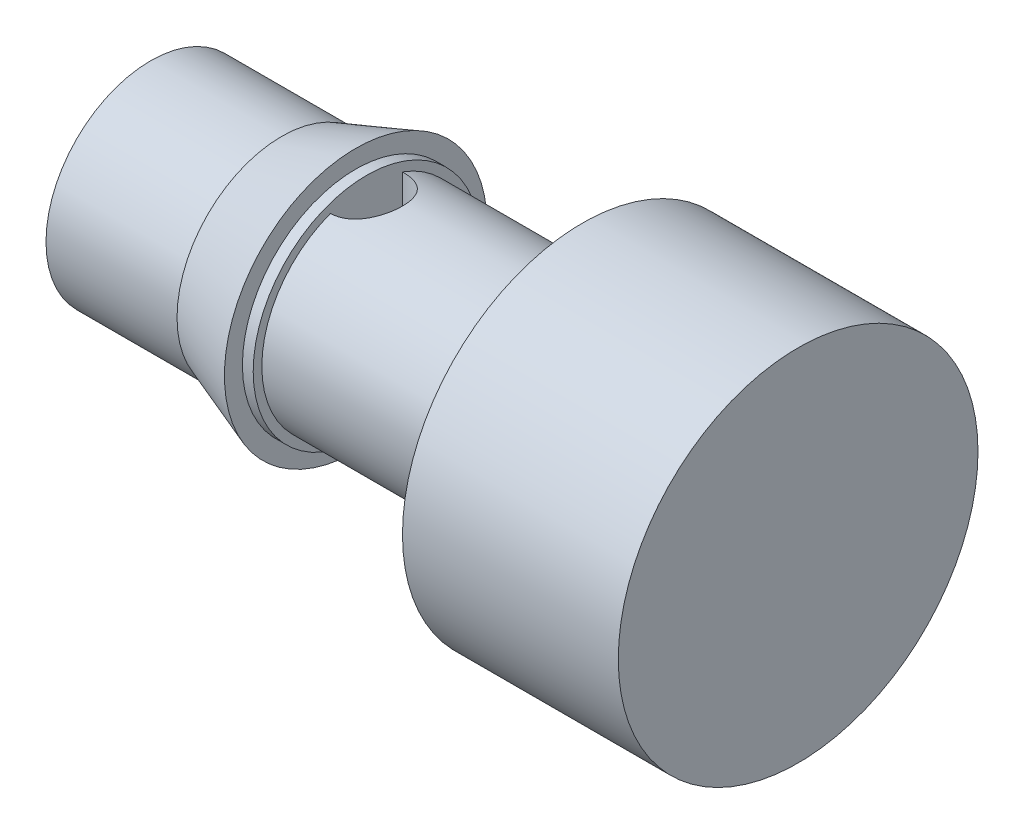
ISO-10303-21;
HEADER;
FILE_DESCRIPTION(('STEP AP214'),'2;1');
FILE_NAME('part.step','',(''),(''),'','','');
FILE_SCHEMA(('AUTOMOTIVE_DESIGN { 1 0 10303 214 1 1 1 1 }'));
ENDSEC;
DATA;
#1=APPLICATION_CONTEXT('core data for automotive mechanical design processes');
#2=APPLICATION_PROTOCOL_DEFINITION('international standard','automotive_design',2000,#1);
#3=PRODUCT_CONTEXT('',#1,'mechanical');
#4=PRODUCT('Part','Part','',(#3));
#5=PRODUCT_RELATED_PRODUCT_CATEGORY('part','',(#4));
#6=PRODUCT_DEFINITION_FORMATION('','',#4);
#7=PRODUCT_DEFINITION_CONTEXT('part definition',#1,'design');
#8=PRODUCT_DEFINITION('design','',#6,#7);
#9=PRODUCT_DEFINITION_SHAPE('','',#8);
#10=(LENGTH_UNIT() NAMED_UNIT(*) SI_UNIT(.MILLI.,.METRE.));
#11=(NAMED_UNIT(*) PLANE_ANGLE_UNIT() SI_UNIT($,.RADIAN.));
#12=(NAMED_UNIT(*) SI_UNIT($,.STERADIAN.) SOLID_ANGLE_UNIT());
#13=UNCERTAINTY_MEASURE_WITH_UNIT(LENGTH_MEASURE(1.E-05),#10,'distance_accuracy_value','');
#14=(GEOMETRIC_REPRESENTATION_CONTEXT(3) GLOBAL_UNCERTAINTY_ASSIGNED_CONTEXT((#13)) GLOBAL_UNIT_ASSIGNED_CONTEXT((#10,
#11,#12)) REPRESENTATION_CONTEXT('',''));
#15=CARTESIAN_POINT('',(0.,0.,0.));
#16=DIRECTION('',(0.,0.,1.));
#17=DIRECTION('',(1.,0.,0.));
#18=AXIS2_PLACEMENT_3D('',#15,#16,#17);
#19=CARTESIAN_POINT('',(6.,0.,0.));
#20=DIRECTION('',(-1.,0.,0.));
#21=DIRECTION('',(0.,0.,1.));
#22=AXIS2_PLACEMENT_3D('',#19,#20,#21);
#23=CYLINDRICAL_SURFACE('',#22,1.455);
#24=CARTESIAN_POINT('',(6.,0.,0.));
#25=DIRECTION('',(1.,0.,0.));
#26=DIRECTION('',(0.,0.,-1.));
#27=AXIS2_PLACEMENT_3D('',#24,#25,#26);
#28=CIRCLE('',#27,1.455);
#29=CARTESIAN_POINT('',(6.,0.,-1.455));
#30=VERTEX_POINT('',#29);
#31=EDGE_CURVE('E164',#30,#30,#28,.T.);
#32=ORIENTED_EDGE('',*,*,#31,.F.);
#33=EDGE_LOOP('',(#32));
#34=FACE_BOUND('',#33,.T.);
#35=CARTESIAN_POINT('',(3.,0.,0.));
#36=DIRECTION('',(-1.,0.,0.));
#37=DIRECTION('',(0.,0.,1.));
#38=AXIS2_PLACEMENT_3D('',#35,#36,#37);
#39=CIRCLE('',#38,1.455);
#40=CARTESIAN_POINT('',(3.,1.36639123240747,-0.500000000000001));
#41=VERTEX_POINT('',#40);
#42=CARTESIAN_POINT('',(3.,-1.36639123240747,-0.500000000000001));
#43=VERTEX_POINT('',#42);
#44=EDGE_CURVE('E191',#41,#43,#39,.T.);
#45=ORIENTED_EDGE('',*,*,#44,.F.);
#46=CARTESIAN_POINT('',(3.,1.36639123240747,0.500000000000001));
#47=CARTESIAN_POINT('',(2.97282044008254,1.36639097811817,0.500000312731613));
#48=CARTESIAN_POINT('',(2.94564304194958,1.3672110489003,0.497776345713997));
#49=CARTESIAN_POINT('',(2.89209683987012,1.37038431023373,0.488971673841802));
#50=CARTESIAN_POINT('',(2.86572812829729,1.37273767525038,0.482390473199555));
#51=CARTESIAN_POINT('',(2.81458437582896,1.37868015875037,0.465132564264616));
#52=CARTESIAN_POINT('',(2.78980617322112,1.38226672943625,0.454464294689386));
#53=CARTESIAN_POINT('',(2.74238273764721,1.39026770944465,0.42936418702639));
#54=CARTESIAN_POINT('',(2.71973802190004,1.39468231873585,0.414931439499747));
#55=CARTESIAN_POINT('',(2.67628200580682,1.40404795409862,0.382068692414853));
#56=CARTESIAN_POINT('',(2.65557235017231,1.40901294814996,0.363508230347457));
#57=CARTESIAN_POINT('',(2.61748973640978,1.41880223847988,0.323194958876108));
#58=CARTESIAN_POINT('',(2.60011735287873,1.42362651040849,0.301441600868594));
#59=CARTESIAN_POINT('',(2.56873456155451,1.43275353066899,0.25461005240966));
#60=CARTESIAN_POINT('',(2.55483159909054,1.43703795070782,0.229455972061945));
#61=CARTESIAN_POINT('',(2.53149510799792,1.44443717268994,0.176993427231699));
#62=CARTESIAN_POINT('',(2.52206029405022,1.44755231093828,0.149685584945858));
#63=CARTESIAN_POINT('',(2.50827538591302,1.45216299283854,0.0947571154949555));
#64=CARTESIAN_POINT('',(2.50375096166485,1.45371391556177,0.0671849745644268));
#65=CARTESIAN_POINT('',(2.4993599452638,1.45521851130384,0.0116321325668065));
#66=CARTESIAN_POINT('',(2.49949207878631,1.45517262131027,-0.016348454628745));
#67=CARTESIAN_POINT('',(2.50430199111636,1.45352574816606,-0.0706863211139652));
#68=CARTESIAN_POINT('',(2.50879020966484,1.45198961593433,-0.09706267186014));
#69=CARTESIAN_POINT('',(2.52187013887379,1.44761714360993,-0.148662052440881));
#70=CARTESIAN_POINT('',(2.53046213173979,1.44478071409985,-0.173885002828482));
#71=CARTESIAN_POINT('',(2.55161083528952,1.43804602880742,-0.222864410317829));
#72=CARTESIAN_POINT('',(2.56421967890936,1.43413390908427,-0.246596372051855));
#73=CARTESIAN_POINT('',(2.59300052287427,1.42565240959854,-0.291662127171063));
#74=CARTESIAN_POINT('',(2.60917355635141,1.42108283939799,-0.312995222496682));
#75=CARTESIAN_POINT('',(2.64556924048506,1.41149683623094,-0.353783192591456));
#76=CARTESIAN_POINT('',(2.6659535496993,1.40646948255308,-0.373091465112166));
#77=CARTESIAN_POINT('',(2.70971096898476,1.39672419493074,-0.408064861632907));
#78=CARTESIAN_POINT('',(2.73308460079606,1.39200631521816,-0.423729348317868));
#79=CARTESIAN_POINT('',(2.78264832167894,1.38335212869181,-0.451190983426911));
#80=CARTESIAN_POINT('',(2.80887746663472,1.37942952410187,-0.462922294548846));
#81=CARTESIAN_POINT('',(2.86310811807453,1.37296824111035,-0.481750423449409));
#82=CARTESIAN_POINT('',(2.89110881913969,1.37042893878043,-0.488849330926126));
#83=CARTESIAN_POINT('',(2.9466602527285,1.36716435499601,-0.497904436508698));
#84=CARTESIAN_POINT('',(2.97416896753564,1.36635848431615,-0.500089329754137));
#85=CARTESIAN_POINT('',(3.02916592318218,1.36642601678656,-0.499905109547407));
#86=CARTESIAN_POINT('',(3.05665416698352,1.3672990898199,-0.497536891336228));
#87=CARTESIAN_POINT('',(3.10975938349391,1.37054542078883,-0.488519667509383));
#88=CARTESIAN_POINT('',(3.13540790954479,1.37286149883476,-0.48203365376347));
#89=CARTESIAN_POINT('',(3.18524603270589,1.37866879378836,-0.465162761685819));
#90=CARTESIAN_POINT('',(3.20943536017642,1.38216022710582,-0.454777165311102));
#91=CARTESIAN_POINT('',(3.25655901904507,1.39006814276105,-0.43001094582003));
#92=CARTESIAN_POINT('',(3.2794250355621,1.39451148507407,-0.415509150754988));
#93=CARTESIAN_POINT('',(3.32248142977751,1.40377216610918,-0.383057444619011));
#94=CARTESIAN_POINT('',(3.34267096826601,1.40858962138712,-0.365106456354439));
#95=CARTESIAN_POINT('',(3.38087999417741,1.4183566247392,-0.325165888852871));
#96=CARTESIAN_POINT('',(3.3987335534274,1.42330014506522,-0.303015612372771));
#97=CARTESIAN_POINT('',(3.43048320392665,1.43251855204168,-0.255911546870538));
#98=CARTESIAN_POINT('',(3.44437940750592,1.43679345766928,-0.230957837452241));
#99=CARTESIAN_POINT('',(3.46769853808854,1.44417620196691,-0.179059058741342));
#100=CARTESIAN_POINT('',(3.47714814746578,1.44729097799921,-0.152127018589827));
#101=CARTESIAN_POINT('',(3.49134145346222,1.45203172010686,-0.0969269784819325));
#102=CARTESIAN_POINT('',(3.49608696803861,1.45365826131074,-0.0686594990512471));
#103=CARTESIAN_POINT('',(3.50056578047329,1.45519317203768,-0.0131041048340675));
#104=CARTESIAN_POINT('',(3.50053661789388,1.45518296986363,0.0141626088901563));
#105=CARTESIAN_POINT('',(3.49605881674393,1.45364883351676,0.068284584430689));
#106=CARTESIAN_POINT('',(3.49161057541087,1.4521250354033,0.0951398830093806));
#107=CARTESIAN_POINT('',(3.4785811711584,1.44776668608656,0.147199119922217));
#108=CARTESIAN_POINT('',(3.47007483164858,1.44495590074719,0.172423918976896));
#109=CARTESIAN_POINT('',(3.44924106511386,1.43831337530625,0.221096451645462));
#110=CARTESIAN_POINT('',(3.43691293401043,1.43448144710052,0.244543856823398));
#111=CARTESIAN_POINT('',(3.40824273974474,1.42600590188723,0.28997734186848));
#112=CARTESIAN_POINT('',(3.39176488452778,1.42133679417001,0.311872906947895));
#113=CARTESIAN_POINT('',(3.35548977465473,1.41176919148188,0.352664883251738));
#114=CARTESIAN_POINT('',(3.33569142778947,1.40687062141728,0.371560303644531));
#115=CARTESIAN_POINT('',(3.29233656772363,1.39714764987157,0.40663128516264));
#116=CARTESIAN_POINT('',(3.26865644725596,1.39233516519014,0.422657858662001));
#117=CARTESIAN_POINT('',(3.21878764286122,1.38357941215645,0.450496342588288));
#118=CARTESIAN_POINT('',(3.19259941591023,1.37963598589265,0.462309018939636));
#119=CARTESIAN_POINT('',(3.13908764556529,1.37320179115005,0.48108071708729));
#120=CARTESIAN_POINT('',(3.11180721552094,1.37067801956557,0.488150816278888));
#121=CARTESIAN_POINT('',(3.05635017006794,1.36727320579147,0.497609344327993));
#122=CARTESIAN_POINT('',(3.02817392360614,1.36639149599994,0.499999675827108));
#123=CARTESIAN_POINT('',(3.,1.36639123240747,0.500000000000001));
#124=B_SPLINE_CURVE_WITH_KNOTS('',3,(#46,#47,#48,#49,#50,#51,#52,#53,#54,#55,#56,#57,#58,#59,
#60,#61,#62,#63,#64,#65,#66,#67,#68,#69,#70,#71,#72,#73,#74,#75,#76,#77,#78,#79,#80,#81,#82,#83,
#84,#85,#86,#87,#88,#89,#90,#91,#92,#93,#94,#95,#96,#97,#98,#99,#100,#101,#102,#103,#104,#105,
#106,#107,#108,#109,#110,#111,#112,#113,#114,#115,#116,#117,#118,#119,#120,#121,#122,#123),
.UNSPECIFIED.,.T.,.F.,(4,2,2,2,2,2,2,2,2,2,2,2,2,2,2,2,2,2,2,2,2,2,2,2,2,2,2,2,2,2,2,2,2,2,2,2,
2,2,4),(0.,0.0814342083502881,0.162877684281834,0.244153899431236,0.325449767856164,
0.409818297556403,0.494201340468621,0.580941073467996,0.667655839514619,0.751179712047528,
0.83468072741757,0.914703835375722,0.994732447100178,1.07584520035367,1.1569814963114,
1.24216162082256,1.32735663254974,1.41391378507749,1.50043186424294,1.58283194249355,
1.66521582074902,1.74452634377262,1.82385147767105,1.90580983357864,1.98779382705759,
2.07401200384483,2.16022773307441,2.24591929981545,2.33157773703578,2.41297604003756,
2.49436702668819,2.57431213634006,2.65427198282888,2.73729800330363,2.82035138727782,
2.90692039451618,2.99347365881173,3.07792147702076,3.16233495435282),.UNSPECIFIED.);
#125=CARTESIAN_POINT('',(3.,1.36639123240747,0.500000000000001));
#126=VERTEX_POINT('',#125);
#127=EDGE_CURVE('E174',#41,#126,#124,.T.);
#128=ORIENTED_EDGE('',*,*,#127,.T.);
#129=CARTESIAN_POINT('',(3.,-1.36639123240747,0.500000000000001));
#130=VERTEX_POINT('',#129);
#131=EDGE_CURVE('E181',#130,#126,#39,.T.);
#132=ORIENTED_EDGE('',*,*,#131,.F.);
#133=CARTESIAN_POINT('',(3.,-1.36639123240747,0.500000000000001));
#134=CARTESIAN_POINT('',(3.02717955991746,-1.36639097811817,0.500000312731613));
#135=CARTESIAN_POINT('',(3.05435695805042,-1.3672110489003,0.497776345713997));
#136=CARTESIAN_POINT('',(3.10790316012988,-1.37038431023373,0.488971673841802));
#137=CARTESIAN_POINT('',(3.13427187170271,-1.37273767525038,0.482390473199555));
#138=CARTESIAN_POINT('',(3.18541562417104,-1.37868015875037,0.465132564264616));
#139=CARTESIAN_POINT('',(3.21019382677888,-1.38226672943625,0.454464294689386));
#140=CARTESIAN_POINT('',(3.25761726235279,-1.39026770944465,0.42936418702639));
#141=CARTESIAN_POINT('',(3.28026197809996,-1.39468231873585,0.414931439499747));
#142=CARTESIAN_POINT('',(3.32371799419318,-1.40404795409862,0.382068692414853));
#143=CARTESIAN_POINT('',(3.34442764982769,-1.40901294814996,0.363508230347457));
#144=CARTESIAN_POINT('',(3.38251026359022,-1.41880223847988,0.323194958876108));
#145=CARTESIAN_POINT('',(3.39988264712127,-1.42362651040849,0.301441600868594));
#146=CARTESIAN_POINT('',(3.43126543844549,-1.43275353066899,0.25461005240966));
#147=CARTESIAN_POINT('',(3.44516840090946,-1.43703795070782,0.229455972061945));
#148=CARTESIAN_POINT('',(3.46850489200208,-1.44443717268994,0.176993427231699));
#149=CARTESIAN_POINT('',(3.47793970594978,-1.44755231093828,0.149685584945858));
#150=CARTESIAN_POINT('',(3.49172461408698,-1.45216299283854,0.0947571154949555));
#151=CARTESIAN_POINT('',(3.49624903833515,-1.45371391556177,0.0671849745644268));
#152=CARTESIAN_POINT('',(3.5006400547362,-1.45521851130384,0.0116321325668065));
#153=CARTESIAN_POINT('',(3.50050792121369,-1.45517262131027,-0.016348454628745));
#154=CARTESIAN_POINT('',(3.49569800888364,-1.45352574816606,-0.0706863211139652));
#155=CARTESIAN_POINT('',(3.49120979033516,-1.45198961593433,-0.0970626718601401));
#156=CARTESIAN_POINT('',(3.47812986112621,-1.44761714360993,-0.148662052440881));
#157=CARTESIAN_POINT('',(3.46953786826021,-1.44478071409985,-0.173885002828482));
#158=CARTESIAN_POINT('',(3.44838916471048,-1.43804602880742,-0.222864410317829));
#159=CARTESIAN_POINT('',(3.43578032109064,-1.43413390908427,-0.246596372051854));
#160=CARTESIAN_POINT('',(3.40699947712573,-1.42565240959854,-0.291662127171063));
#161=CARTESIAN_POINT('',(3.39082644364859,-1.42108283939799,-0.312995222496682));
#162=CARTESIAN_POINT('',(3.35443075951494,-1.41149683623094,-0.353783192591456));
#163=CARTESIAN_POINT('',(3.3340464503007,-1.40646948255308,-0.373091465112166));
#164=CARTESIAN_POINT('',(3.29028903101524,-1.39672419493074,-0.408064861632907));
#165=CARTESIAN_POINT('',(3.26691539920394,-1.39200631521816,-0.423729348317868));
#166=CARTESIAN_POINT('',(3.21735167832106,-1.38335212869181,-0.451190983426911));
#167=CARTESIAN_POINT('',(3.19112253336528,-1.37942952410187,-0.462922294548846));
#168=CARTESIAN_POINT('',(3.13689188192548,-1.37296824111035,-0.481750423449409));
#169=CARTESIAN_POINT('',(3.10889118086031,-1.37042893878043,-0.488849330926126));
#170=CARTESIAN_POINT('',(3.0533397472715,-1.36716435499601,-0.497904436508698));
#171=CARTESIAN_POINT('',(3.02583103246436,-1.36635848431615,-0.500089329754137));
#172=CARTESIAN_POINT('',(2.97083407681782,-1.36642601678656,-0.499905109547407));
#173=CARTESIAN_POINT('',(2.94334583301648,-1.3672990898199,-0.497536891336228));
#174=CARTESIAN_POINT('',(2.89024061650609,-1.37054542078883,-0.488519667509383));
#175=CARTESIAN_POINT('',(2.86459209045521,-1.37286149883476,-0.48203365376347));
#176=CARTESIAN_POINT('',(2.81475396729411,-1.37866879378836,-0.465162761685819));
#177=CARTESIAN_POINT('',(2.79056463982358,-1.38216022710582,-0.454777165311102));
#178=CARTESIAN_POINT('',(2.74344098095493,-1.39006814276105,-0.43001094582003));
#179=CARTESIAN_POINT('',(2.7205749644379,-1.39451148507407,-0.415509150754988));
#180=CARTESIAN_POINT('',(2.6775185702225,-1.40377216610918,-0.383057444619011));
#181=CARTESIAN_POINT('',(2.65732903173399,-1.40858962138712,-0.365106456354439));
#182=CARTESIAN_POINT('',(2.61912000582259,-1.4183566247392,-0.325165888852871));
#183=CARTESIAN_POINT('',(2.6012664465726,-1.42330014506522,-0.303015612372771));
#184=CARTESIAN_POINT('',(2.56951679607335,-1.43251855204168,-0.255911546870538));
#185=CARTESIAN_POINT('',(2.55562059249408,-1.43679345766928,-0.230957837452241));
#186=CARTESIAN_POINT('',(2.53230146191146,-1.44417620196691,-0.179059058741342));
#187=CARTESIAN_POINT('',(2.52285185253422,-1.44729097799921,-0.152127018589827));
#188=CARTESIAN_POINT('',(2.50865854653778,-1.45203172010686,-0.0969269784819325));
#189=CARTESIAN_POINT('',(2.50391303196139,-1.45365826131074,-0.068659499051247));
#190=CARTESIAN_POINT('',(2.49943421952671,-1.45519317203768,-0.0131041048340675));
#191=CARTESIAN_POINT('',(2.49946338210612,-1.45518296986363,0.0141626088901562));
#192=CARTESIAN_POINT('',(2.50394118325607,-1.45364883351676,0.068284584430689));
#193=CARTESIAN_POINT('',(2.50838942458913,-1.4521250354033,0.0951398830093806));
#194=CARTESIAN_POINT('',(2.5214188288416,-1.44776668608656,0.147199119922217));
#195=CARTESIAN_POINT('',(2.52992516835142,-1.44495590074719,0.172423918976896));
#196=CARTESIAN_POINT('',(2.55075893488614,-1.43831337530625,0.221096451645462));
#197=CARTESIAN_POINT('',(2.56308706598957,-1.43448144710052,0.244543856823398));
#198=CARTESIAN_POINT('',(2.59175726025526,-1.42600590188723,0.28997734186848));
#199=CARTESIAN_POINT('',(2.60823511547222,-1.42133679417001,0.311872906947894));
#200=CARTESIAN_POINT('',(2.64451022534527,-1.41176919148188,0.352664883251738));
#201=CARTESIAN_POINT('',(2.66430857221053,-1.40687062141728,0.371560303644531));
#202=CARTESIAN_POINT('',(2.70766343227637,-1.39714764987157,0.40663128516264));
#203=CARTESIAN_POINT('',(2.73134355274404,-1.39233516519014,0.422657858662002));
#204=CARTESIAN_POINT('',(2.78121235713878,-1.38357941215645,0.450496342588288));
#205=CARTESIAN_POINT('',(2.80740058408977,-1.37963598589265,0.462309018939636));
#206=CARTESIAN_POINT('',(2.86091235443471,-1.37320179115005,0.48108071708729));
#207=CARTESIAN_POINT('',(2.88819278447906,-1.37067801956557,0.488150816278888));
#208=CARTESIAN_POINT('',(2.94364982993206,-1.36727320579147,0.497609344327993));
#209=CARTESIAN_POINT('',(2.97182607639386,-1.36639149599994,0.499999675827108));
#210=CARTESIAN_POINT('',(3.,-1.36639123240747,0.500000000000001));
#211=B_SPLINE_CURVE_WITH_KNOTS('',3,(#133,#134,#135,#136,#137,#138,#139,#140,#141,#142,#143,
#144,#145,#146,#147,#148,#149,#150,#151,#152,#153,#154,#155,#156,#157,#158,#159,#160,#161,#162,
#163,#164,#165,#166,#167,#168,#169,#170,#171,#172,#173,#174,#175,#176,#177,#178,#179,#180,#181,
#182,#183,#184,#185,#186,#187,#188,#189,#190,#191,#192,#193,#194,#195,#196,#197,#198,#199,#200,
#201,#202,#203,#204,#205,#206,#207,#208,#209,#210),.UNSPECIFIED.,.T.,.F.,(4,2,2,2,2,2,2,2,2,2,2,
2,2,2,2,2,2,2,2,2,2,2,2,2,2,2,2,2,2,2,2,2,2,2,2,2,2,2,4),(0.,0.0814342083502881,
0.162877684281834,0.244153899431236,0.325449767856164,0.409818297556403,0.494201340468621,
0.580941073467996,0.667655839514619,0.751179712047528,0.83468072741757,0.914703835375722,
0.994732447100178,1.07584520035367,1.1569814963114,1.24216162082256,1.32735663254974,
1.41391378507749,1.50043186424294,1.58283194249355,1.66521582074902,1.74452634377262,
1.82385147767105,1.90580983357864,1.98779382705759,2.07401200384483,2.16022773307441,
2.24591929981545,2.33157773703578,2.41297604003756,2.49436702668819,2.57431213634006,
2.65427198282888,2.73729800330363,2.82035138727783,2.90692039451618,2.99347365881173,
3.07792147702076,3.16233495435282),.UNSPECIFIED.);
#212=EDGE_CURVE('E180',#130,#43,#211,.T.);
#213=ORIENTED_EDGE('',*,*,#212,.T.);
#214=EDGE_LOOP('',(#45,#128,#132,#213));
#215=FACE_BOUND('',#214,.T.);
#216=ADVANCED_FACE('F40',(#34,#215),#23,.T.);
#217=CARTESIAN_POINT('',(3.,-2.5,0.));
#218=DIRECTION('',(0.,1.,0.));
#219=DIRECTION('',(0.,0.,1.));
#220=AXIS2_PLACEMENT_3D('',#217,#218,#219);
#221=CYLINDRICAL_SURFACE('',#220,0.500000000000001);
#222=DIRECTION('',(0.,1.,0.));
#223=VECTOR('',#222,1.);
#224=CARTESIAN_POINT('',(3.,-2.5,0.500000000000001));
#225=LINE('',#224,#223);
#226=EDGE_CURVE('E97',#126,#130,#225,.F.);
#227=ORIENTED_EDGE('',*,*,#226,.F.);
#228=ORIENTED_EDGE('',*,*,#127,.F.);
#229=DIRECTION('',(0.,1.,0.));
#230=VECTOR('',#229,1.);
#231=CARTESIAN_POINT('',(3.,-2.5,-0.500000000000001));
#232=LINE('',#231,#230);
#233=EDGE_CURVE('E101',#43,#41,#232,.T.);
#234=ORIENTED_EDGE('',*,*,#233,.F.);
#235=ORIENTED_EDGE('',*,*,#212,.F.);
#236=EDGE_LOOP('',(#227,#228,#234,#235));
#237=FACE_BOUND('',#236,.T.);
#238=ADVANCED_FACE('F142',(#237),#221,.F.);
#239=CARTESIAN_POINT('',(9.,0.,0.));
#240=DIRECTION('',(-1.,0.,0.));
#241=DIRECTION('',(0.,0.,1.));
#242=AXIS2_PLACEMENT_3D('',#239,#240,#241);
#243=CYLINDRICAL_SURFACE('',#242,2.5);
#244=CARTESIAN_POINT('',(9.,0.,0.));
#245=DIRECTION('',(1.,0.,0.));
#246=DIRECTION('',(0.,0.,-1.));
#247=AXIS2_PLACEMENT_3D('',#244,#245,#246);
#248=CIRCLE('',#247,2.5);
#249=CARTESIAN_POINT('',(9.,0.,-2.5));
#250=VERTEX_POINT('',#249);
#251=EDGE_CURVE('E165',#250,#250,#248,.T.);
#252=ORIENTED_EDGE('',*,*,#251,.F.);
#253=EDGE_LOOP('',(#252));
#254=FACE_BOUND('',#253,.T.);
#255=CARTESIAN_POINT('',(6.,0.,0.));
#256=DIRECTION('',(1.,0.,0.));
#257=DIRECTION('',(0.,0.,-1.));
#258=AXIS2_PLACEMENT_3D('',#255,#256,#257);
#259=CIRCLE('',#258,2.5);
#260=CARTESIAN_POINT('',(6.,0.,-2.5));
#261=VERTEX_POINT('',#260);
#262=EDGE_CURVE('E170',#261,#261,#259,.T.);
#263=ORIENTED_EDGE('',*,*,#262,.T.);
#264=EDGE_LOOP('',(#263));
#265=FACE_BOUND('',#264,.T.);
#266=ADVANCED_FACE('F148',(#254,#265),#243,.T.);
#267=CARTESIAN_POINT('',(9.,0.,0.));
#268=DIRECTION('',(1.,0.,0.));
#269=DIRECTION('',(0.,0.,-1.));
#270=AXIS2_PLACEMENT_3D('',#267,#268,#269);
#271=PLANE('',#270);
#272=ORIENTED_EDGE('',*,*,#251,.T.);
#273=EDGE_LOOP('',(#272));
#274=FACE_BOUND('',#273,.T.);
#275=ADVANCED_FACE('F202',(#274),#271,.T.);
#276=CARTESIAN_POINT('',(6.,0.,0.));
#277=DIRECTION('',(1.,0.,0.));
#278=DIRECTION('',(0.,0.,-1.));
#279=AXIS2_PLACEMENT_3D('',#276,#277,#278);
#280=PLANE('',#279);
#281=ORIENTED_EDGE('',*,*,#31,.T.);
#282=EDGE_LOOP('',(#281));
#283=FACE_BOUND('',#282,.T.);
#284=ORIENTED_EDGE('',*,*,#262,.F.);
#285=EDGE_LOOP('',(#284));
#286=FACE_BOUND('',#285,.T.);
#287=ADVANCED_FACE('F131',(#283,#286),#280,.F.);
#288=CARTESIAN_POINT('',(3.,0.,0.));
#289=DIRECTION('',(-1.,0.,0.));
#290=DIRECTION('',(0.,0.,1.));
#291=AXIS2_PLACEMENT_3D('',#288,#289,#290);
#292=PLANE('',#291);
#293=CARTESIAN_POINT('',(3.,0.,0.));
#294=DIRECTION('',(-1.,0.,0.));
#295=DIRECTION('',(0.,0.,1.));
#296=AXIS2_PLACEMENT_3D('',#293,#294,#295);
#297=CIRCLE('',#296,1.575);
#298=CARTESIAN_POINT('',(3.,0.,1.575));
#299=VERTEX_POINT('',#298);
#300=EDGE_CURVE('E106',#299,#299,#297,.T.);
#301=ORIENTED_EDGE('',*,*,#300,.F.);
#302=EDGE_LOOP('',(#301));
#303=FACE_BOUND('',#302,.T.);
#304=ORIENTED_EDGE('',*,*,#233,.T.);
#305=ORIENTED_EDGE('',*,*,#44,.T.);
#306=EDGE_LOOP('',(#304,#305));
#307=FACE_BOUND('',#306,.T.);
#308=ORIENTED_EDGE('',*,*,#226,.T.);
#309=ORIENTED_EDGE('',*,*,#131,.T.);
#310=EDGE_LOOP('',(#308,#309));
#311=FACE_BOUND('',#310,.T.);
#312=ADVANCED_FACE('F128',(#303,#307,#311),#292,.F.);
#313=CARTESIAN_POINT('',(2.85,0.,0.));
#314=DIRECTION('',(1.,0.,0.));
#315=DIRECTION('',(0.,0.,-1.));
#316=AXIS2_PLACEMENT_3D('',#313,#314,#315);
#317=CYLINDRICAL_SURFACE('',#316,1.575);
#318=CARTESIAN_POINT('',(2.85,0.,0.));
#319=DIRECTION('',(-1.,0.,0.));
#320=DIRECTION('',(0.,0.,1.));
#321=AXIS2_PLACEMENT_3D('',#318,#319,#320);
#322=CIRCLE('',#321,1.575);
#323=CARTESIAN_POINT('',(2.85,0.,1.575));
#324=VERTEX_POINT('',#323);
#325=EDGE_CURVE('E195',#324,#324,#322,.T.);
#326=ORIENTED_EDGE('',*,*,#325,.F.);
#327=EDGE_LOOP('',(#326));
#328=FACE_BOUND('',#327,.T.);
#329=ORIENTED_EDGE('',*,*,#300,.T.);
#330=EDGE_LOOP('',(#329));
#331=FACE_BOUND('',#330,.T.);
#332=ADVANCED_FACE('F130',(#328,#331),#317,.T.);
#333=CARTESIAN_POINT('',(2.85,0.,0.));
#334=DIRECTION('',(1.,0.,0.));
#335=DIRECTION('',(0.,0.,-1.));
#336=AXIS2_PLACEMENT_3D('',#333,#334,#335);
#337=CONICAL_SURFACE('',#336,1.825,0.345244925108636);
#338=CARTESIAN_POINT('',(2.85,0.,0.));
#339=DIRECTION('',(1.,0.,0.));
#340=DIRECTION('',(0.,0.,-1.));
#341=AXIS2_PLACEMENT_3D('',#338,#339,#340);
#342=CIRCLE('',#341,1.825);
#343=CARTESIAN_POINT('',(2.85,0.,-1.825));
#344=VERTEX_POINT('',#343);
#345=EDGE_CURVE('E299',#344,#344,#342,.T.);
#346=ORIENTED_EDGE('',*,*,#345,.F.);
#347=EDGE_LOOP('',(#346));
#348=FACE_BOUND('',#347,.T.);
#349=CARTESIAN_POINT('',(1.82121951219512,0.,0.));
#350=DIRECTION('',(1.,0.,0.));
#351=DIRECTION('',(0.,0.,-1.));
#352=AXIS2_PLACEMENT_3D('',#349,#350,#351);
#353=CIRCLE('',#352,1.455);
#354=CARTESIAN_POINT('',(1.82121951219512,0.,-1.455));
#355=VERTEX_POINT('',#354);
#356=EDGE_CURVE('E94',#355,#355,#353,.F.);
#357=ORIENTED_EDGE('',*,*,#356,.F.);
#358=EDGE_LOOP('',(#357));
#359=FACE_BOUND('',#358,.T.);
#360=ADVANCED_FACE('F119',(#348,#359),#337,.T.);
#361=CARTESIAN_POINT('',(2.85,0.8,0.));
#362=DIRECTION('',(1.,0.,0.));
#363=DIRECTION('',(0.,0.,-1.));
#364=AXIS2_PLACEMENT_3D('',#361,#362,#363);
#365=PLANE('',#364);
#366=ORIENTED_EDGE('',*,*,#325,.T.);
#367=EDGE_LOOP('',(#366));
#368=FACE_BOUND('',#367,.T.);
#369=ORIENTED_EDGE('',*,*,#345,.T.);
#370=EDGE_LOOP('',(#369));
#371=FACE_BOUND('',#370,.T.);
#372=ADVANCED_FACE('F120',(#368,#371),#365,.T.);
#373=CARTESIAN_POINT('',(0.,0.,0.));
#374=DIRECTION('',(1.,0.,0.));
#375=DIRECTION('',(0.,0.,-1.));
#376=AXIS2_PLACEMENT_3D('',#373,#374,#375);
#377=PLANE('',#376);
#378=CARTESIAN_POINT('',(0.,0.,0.));
#379=DIRECTION('',(1.,0.,0.));
#380=DIRECTION('',(0.,0.,-1.));
#381=AXIS2_PLACEMENT_3D('',#378,#379,#380);
#382=CIRCLE('',#381,1.455);
#383=CARTESIAN_POINT('',(0.,0.,-1.455));
#384=VERTEX_POINT('',#383);
#385=EDGE_CURVE('E163',#384,#384,#382,.T.);
#386=ORIENTED_EDGE('',*,*,#385,.F.);
#387=EDGE_LOOP('',(#386));
#388=FACE_BOUND('',#387,.T.);
#389=ADVANCED_FACE('F124',(#388),#377,.F.);
#390=ORIENTED_EDGE('',*,*,#356,.T.);
#391=EDGE_LOOP('',(#390));
#392=FACE_BOUND('',#391,.T.);
#393=ORIENTED_EDGE('',*,*,#385,.T.);
#394=EDGE_LOOP('',(#393));
#395=FACE_BOUND('',#394,.T.);
#396=ADVANCED_FACE('F42',(#392,#395),#23,.T.);
#397=CLOSED_SHELL('',(#216,#238,#266,#275,#287,#312,#332,#360,#372,#389,#396));
#398=DIRECTION('',(0.,1.,0.));
#399=VECTOR('',#398,1.);
#400=CARTESIAN_POINT('',(2.85,-2.5,0.476969600708474));
#401=LINE('',#400,#399);
#402=CARTESIAN_POINT('',(2.85,0.642261628933256,0.476969600708474));
#403=VERTEX_POINT('',#402);
#404=CARTESIAN_POINT('',(2.85,-0.642261628933256,0.476969600708474));
#405=VERTEX_POINT('',#404);
#406=EDGE_CURVE('E89',#403,#405,#401,.F.);
#407=ORIENTED_EDGE('',*,*,#406,.T.);
#408=CARTESIAN_POINT('',(3.,-0.624499799839839,0.500000000000001));
#409=CARTESIAN_POINT('',(2.97515188727883,-0.624503200290233,0.499997848841941));
#410=CARTESIAN_POINT('',(2.9502648658519,-0.626010570835346,0.498130775398663));
#411=CARTESIAN_POINT('',(2.90132947196825,-0.631774868821911,0.490795803331738));
#412=CARTESIAN_POINT('',(2.8772835654539,-0.636039265856459,0.485318121722204));
#413=CARTESIAN_POINT('',(2.83088707092046,-0.646600341316164,0.471152295647484));
#414=CARTESIAN_POINT('',(2.80852375652727,-0.652879349672132,0.462491973331138));
#415=CARTESIAN_POINT('',(2.76559645534474,-0.666731802857729,0.442287782247697));
#416=CARTESIAN_POINT('',(2.7450325176574,-0.674305282994703,0.430743834824366));
#417=CARTESIAN_POINT('',(2.70325393820921,-0.691118445498845,0.403295751713458));
#418=CARTESIAN_POINT('',(2.68232210366696,-0.700445352909385,0.387014437477002));
#419=CARTESIAN_POINT('',(2.64324692034201,-0.719011283419506,0.351323465798752));
#420=CARTESIAN_POINT('',(2.62510600108643,-0.728250223453316,0.331911112518966));
#421=CARTESIAN_POINT('',(2.58995856594075,-0.746917815564037,0.287674666103397));
#422=CARTESIAN_POINT('',(2.57335293275828,-0.756234888965801,0.262480227564223));
#423=CARTESIAN_POINT('',(2.54474991809474,-0.77273292679656,0.208961628334926));
#424=CARTESIAN_POINT('',(2.5327479736995,-0.779916004719351,0.180640602591297));
#425=CARTESIAN_POINT('',(2.51500707575717,-0.790679365272802,0.124710751344807));
#426=CARTESIAN_POINT('',(2.50875543344122,-0.794551689688153,0.0973222544188964));
#427=CARTESIAN_POINT('',(2.50094717214264,-0.799402177516808,0.0416420402649051));
#428=CARTESIAN_POINT('',(2.49938561755178,-0.800383383374627,0.0133513042256104));
#429=CARTESIAN_POINT('',(2.50094227571104,-0.79941163643011,-0.0392263313685366));
#430=CARTESIAN_POINT('',(2.50346055052036,-0.797834799247608,-0.0635410093095149));
#431=CARTESIAN_POINT('',(2.51194679374533,-0.7925810890449,-0.111322658361468));
#432=CARTESIAN_POINT('',(2.51791502289501,-0.788904057300469,-0.13478956525879));
#433=CARTESIAN_POINT('',(2.53304151003885,-0.7797525344587,-0.18035564683083));
#434=CARTESIAN_POINT('',(2.54220792961944,-0.774273446695649,-0.202451150197294));
#435=CARTESIAN_POINT('',(2.563387502104,-0.761942531557323,-0.244807688187753));
#436=CARTESIAN_POINT('',(2.57540130355624,-0.755090391496905,-0.265068303424001));
#437=CARTESIAN_POINT('',(2.60361126613175,-0.739572899003172,-0.305885406226817));
#438=CARTESIAN_POINT('',(2.62014185069693,-0.730788017228577,-0.326164937967581));
#439=CARTESIAN_POINT('',(2.65605295208935,-0.712781851008948,-0.3638394383622));
#440=CARTESIAN_POINT('',(2.67543761057862,-0.703559945796684,-0.381230135515853));
#441=CARTESIAN_POINT('',(2.71948224916244,-0.684285768448782,-0.414941783571727));
#442=CARTESIAN_POINT('',(2.74450055234012,-0.674282326132779,-0.430826461919787));
#443=CARTESIAN_POINT('',(2.79745844790937,-0.656056556381597,-0.458104612813235));
#444=CARTESIAN_POINT('',(2.82539253758217,-0.647830960766718,-0.469506358413433));
#445=CARTESIAN_POINT('',(2.87590776115515,-0.63636750626848,-0.484874267412666));
#446=CARTESIAN_POINT('',(2.89796438505507,-0.632386817221088,-0.490007366886885));
#447=CARTESIAN_POINT('',(2.94284607549957,-0.626716555503059,-0.497240674150094));
#448=CARTESIAN_POINT('',(2.96567004841596,-0.625023852949712,-0.4993450254131));
#449=CARTESIAN_POINT('',(3.01149147221611,-0.624184534120656,-0.500394143818034));
#450=CARTESIAN_POINT('',(3.03448920054633,-0.625043752561739,-0.499331670306306));
#451=CARTESIAN_POINT('',(3.07991223241264,-0.629184171450818,-0.49410293422395));
#452=CARTESIAN_POINT('',(3.10233704598517,-0.632467377618626,-0.489934101281048));
#453=CARTESIAN_POINT('',(3.14568735354632,-0.640920242407828,-0.478819742899321));
#454=CARTESIAN_POINT('',(3.16663146933261,-0.646057911748684,-0.471921122507153));
#455=CARTESIAN_POINT('',(3.20711493382279,-0.657662293763365,-0.455609807754092));
#456=CARTESIAN_POINT('',(3.2266537808098,-0.664129477959633,-0.446196221085684));
#457=CARTESIAN_POINT('',(3.26772241567081,-0.679148815955747,-0.423061507089279));
#458=CARTESIAN_POINT('',(3.28892301649973,-0.687863502953158,-0.408861495256883));
#459=CARTESIAN_POINT('',(3.32887402097566,-0.705575832002844,-0.377476105289946));
#460=CARTESIAN_POINT('',(3.34762184679119,-0.714573759613416,-0.360287629798641));
#461=CARTESIAN_POINT('',(3.38519329849726,-0.733532656075889,-0.320152263799678));
#462=CARTESIAN_POINT('',(3.40354742280307,-0.743416819150388,-0.296723979885666));
#463=CARTESIAN_POINT('',(3.43602746075034,-0.761536995859996,-0.246519995147831));
#464=CARTESIAN_POINT('',(3.45015535598946,-0.76977378131653,-0.219745871499465));
#465=CARTESIAN_POINT('',(3.47279799648106,-0.783237023830245,-0.16517036025464));
#466=CARTESIAN_POINT('',(3.48159768258831,-0.788613938356721,-0.137525929017808));
#467=CARTESIAN_POINT('',(3.49429066747243,-0.796428040352159,-0.0807443995538984));
#468=CARTESIAN_POINT('',(3.49819075590445,-0.798869295732013,-0.0516094252953465));
#469=CARTESIAN_POINT('',(3.50061860801551,-0.800386742994235,0.00263962879872523));
#470=CARTESIAN_POINT('',(3.49985431071479,-0.799906402494467,0.02771251903819));
#471=CARTESIAN_POINT('',(3.49461533001027,-0.796642959835088,0.0773119244366906));
#472=CARTESIAN_POINT('',(3.49014081496969,-0.793859962166072,0.101838464336298));
#473=CARTESIAN_POINT('',(3.47793581004936,-0.786384418755919,0.148817317874211));
#474=CARTESIAN_POINT('',(3.47032366405072,-0.781761469886804,0.171312072271324));
#475=CARTESIAN_POINT('',(3.45217602873437,-0.770979874709059,0.214685747644526));
#476=CARTESIAN_POINT('',(3.44164004620977,-0.764820969325622,0.235564395247296));
#477=CARTESIAN_POINT('',(3.41673576840352,-0.750701368959298,0.277462694988267));
#478=CARTESIAN_POINT('',(3.40208320747241,-0.742620009867823,0.298272050864885));
#479=CARTESIAN_POINT('',(3.36996934786692,-0.72573456182495,0.337286643342166));
#480=CARTESIAN_POINT('',(3.35250487990162,-0.716929662922482,0.355488897222093));
#481=CARTESIAN_POINT('',(3.31235349507869,-0.698001660398098,0.391489440520323));
#482=CARTESIAN_POINT('',(3.28927666192923,-0.687871485785254,0.408851319495265));
#483=CARTESIAN_POINT('',(3.24014213359595,-0.668699285988146,0.439509300022977));
#484=CARTESIAN_POINT('',(3.21408609803696,-0.659656660668205,0.452807650228399));
#485=CARTESIAN_POINT('',(3.16543889282813,-0.645719104320854,0.472396443692923));
#486=CARTESIAN_POINT('',(3.14334572764826,-0.640349361398609,0.479584865105525));
#487=CARTESIAN_POINT('',(3.09801228881712,-0.631756633751757,0.490851288721631));
#488=CARTESIAN_POINT('',(3.07477589799034,-0.628526857600702,0.494939136981619));
#489=CARTESIAN_POINT('',(3.04278779045486,-0.625905825557576,0.49823962473239));
#490=CARTESIAN_POINT('',(3.03425434179321,-0.625380278187307,0.498898685038324));
#491=CARTESIAN_POINT('',(3.01714881339141,-0.624676634780186,0.499779298937153));
#492=CARTESIAN_POINT('',(3.00857672447933,-0.624498626119868,0.500000742506693));
#493=CARTESIAN_POINT('',(3.,-0.624499799839839,0.500000000000001));
#494=B_SPLINE_CURVE_WITH_KNOTS('',3,(#408,#409,#410,#411,#412,#413,#414,#415,#416,#417,#418,
#419,#420,#421,#422,#423,#424,#425,#426,#427,#428,#429,#430,#431,#432,#433,#434,#435,#436,#437,
#438,#439,#440,#441,#442,#443,#444,#445,#446,#447,#448,#449,#450,#451,#452,#453,#454,#455,#456,
#457,#458,#459,#460,#461,#462,#463,#464,#465,#466,#467,#468,#469,#470,#471,#472,#473,#474,#475,
#476,#477,#478,#479,#480,#481,#482,#483,#484,#485,#486,#487,#488,#489,#490,#491,#492,#493),
.UNSPECIFIED.,.T.,.F.,(4,2,2,2,2,2,2,2,2,2,2,2,2,2,2,2,2,2,2,2,2,2,2,2,2,2,2,2,2,2,2,2,2,2,2,2,
2,2,2,2,2,2,4),(0.,0.0745049776048059,0.149212661758839,0.223282222452161,0.297353803751101,
0.38136248297603,0.465443883991645,0.559668944137827,0.653800370957042,0.738361651261593,
0.822833912369551,0.895969278334046,0.969110172305657,1.04243909930383,1.11578474451269,
1.19825801932843,1.28085217606474,1.37423227168329,1.46743922038111,1.53613110192107,
1.60472892002916,1.67348370096296,1.74229543664033,1.8099728493744,1.87767430594854,
1.95826533444052,2.03894039394102,2.13254639464356,2.22610843624651,2.3140803219782,
2.40193016503585,2.4768144061005,2.55169524923433,2.6239782764577,2.69627350415153,
2.77607257643498,2.85596222783547,2.947367269685,3.03872163834155,3.10998760908165,
3.18102631185354,3.20673643627799,3.23245302378809),.UNSPECIFIED.);
#495=CARTESIAN_POINT('',(2.85,-0.642261628933256,-0.476969600708474));
#496=VERTEX_POINT('',#495);
#497=EDGE_CURVE('E11',#405,#496,#494,.T.);
#498=ORIENTED_EDGE('',*,*,#497,.T.);
#499=DIRECTION('',(0.,1.,0.));
#500=VECTOR('',#499,1.);
#501=CARTESIAN_POINT('',(2.85,-2.5,-0.476969600708474));
#502=LINE('',#501,#500);
#503=CARTESIAN_POINT('',(2.85,0.642261628933256,-0.476969600708474));
#504=VERTEX_POINT('',#503);
#505=EDGE_CURVE('E93',#496,#504,#502,.T.);
#506=ORIENTED_EDGE('',*,*,#505,.T.);
#507=CARTESIAN_POINT('',(3.,0.624499799839839,0.500000000000001));
#508=CARTESIAN_POINT('',(3.02484811272117,0.624503200290233,0.499997848841941));
#509=CARTESIAN_POINT('',(3.0497351341481,0.626010570835346,0.498130775398663));
#510=CARTESIAN_POINT('',(3.09867052803175,0.631774868821911,0.490795803331738));
#511=CARTESIAN_POINT('',(3.1227164345461,0.636039265856459,0.485318121722204));
#512=CARTESIAN_POINT('',(3.16911292907954,0.646600341316164,0.471152295647484));
#513=CARTESIAN_POINT('',(3.19147624347273,0.652879349672132,0.462491973331138));
#514=CARTESIAN_POINT('',(3.23440354465526,0.666731802857729,0.442287782247697));
#515=CARTESIAN_POINT('',(3.2549674823426,0.674305282994703,0.430743834824366));
#516=CARTESIAN_POINT('',(3.29674606179079,0.691118445498845,0.403295751713458));
#517=CARTESIAN_POINT('',(3.31767789633304,0.700445352909385,0.387014437477002));
#518=CARTESIAN_POINT('',(3.35675307965799,0.719011283419506,0.351323465798752));
#519=CARTESIAN_POINT('',(3.37489399891357,0.728250223453316,0.331911112518966));
#520=CARTESIAN_POINT('',(3.41004143405925,0.746917815564037,0.287674666103397));
#521=CARTESIAN_POINT('',(3.42664706724172,0.756234888965801,0.262480227564223));
#522=CARTESIAN_POINT('',(3.45525008190526,0.77273292679656,0.208961628334926));
#523=CARTESIAN_POINT('',(3.4672520263005,0.779916004719351,0.180640602591297));
#524=CARTESIAN_POINT('',(3.48499292424283,0.790679365272802,0.124710751344807));
#525=CARTESIAN_POINT('',(3.49124456655878,0.794551689688153,0.0973222544188964));
#526=CARTESIAN_POINT('',(3.49905282785736,0.799402177516808,0.0416420402649051));
#527=CARTESIAN_POINT('',(3.50061438244822,0.800383383374627,0.0133513042256105));
#528=CARTESIAN_POINT('',(3.49905772428896,0.79941163643011,-0.0392263313685365));
#529=CARTESIAN_POINT('',(3.49653944947964,0.797834799247608,-0.0635410093095149));
#530=CARTESIAN_POINT('',(3.48805320625467,0.7925810890449,-0.111322658361468));
#531=CARTESIAN_POINT('',(3.48208497710499,0.788904057300469,-0.13478956525879));
#532=CARTESIAN_POINT('',(3.46695848996115,0.7797525344587,-0.18035564683083));
#533=CARTESIAN_POINT('',(3.45779207038056,0.774273446695649,-0.202451150197294));
#534=CARTESIAN_POINT('',(3.436612497896,0.761942531557323,-0.244807688187753));
#535=CARTESIAN_POINT('',(3.42459869644376,0.755090391496905,-0.265068303424001));
#536=CARTESIAN_POINT('',(3.39638873386825,0.739572899003172,-0.305885406226817));
#537=CARTESIAN_POINT('',(3.37985814930307,0.730788017228577,-0.326164937967581));
#538=CARTESIAN_POINT('',(3.34394704791065,0.712781851008948,-0.3638394383622));
#539=CARTESIAN_POINT('',(3.32456238942138,0.703559945796684,-0.381230135515853));
#540=CARTESIAN_POINT('',(3.28051775083756,0.684285768448782,-0.414941783571727));
#541=CARTESIAN_POINT('',(3.25549944765988,0.674282326132779,-0.430826461919787));
#542=CARTESIAN_POINT('',(3.20254155209063,0.656056556381597,-0.458104612813235));
#543=CARTESIAN_POINT('',(3.17460746241783,0.647830960766718,-0.469506358413433));
#544=CARTESIAN_POINT('',(3.12409223884485,0.63636750626848,-0.484874267412666));
#545=CARTESIAN_POINT('',(3.10203561494493,0.632386817221088,-0.490007366886885));
#546=CARTESIAN_POINT('',(3.05715392450043,0.626716555503059,-0.497240674150094));
#547=CARTESIAN_POINT('',(3.03432995158404,0.625023852949712,-0.4993450254131));
#548=CARTESIAN_POINT('',(2.98850852778389,0.624184534120656,-0.500394143818034));
#549=CARTESIAN_POINT('',(2.96551079945367,0.625043752561739,-0.499331670306306));
#550=CARTESIAN_POINT('',(2.92008776758736,0.629184171450818,-0.49410293422395));
#551=CARTESIAN_POINT('',(2.89766295401483,0.632467377618626,-0.489934101281048));
#552=CARTESIAN_POINT('',(2.85431264645368,0.640920242407828,-0.478819742899321));
#553=CARTESIAN_POINT('',(2.83336853066739,0.646057911748684,-0.471921122507153));
#554=CARTESIAN_POINT('',(2.79288506617721,0.657662293763365,-0.455609807754092));
#555=CARTESIAN_POINT('',(2.7733462191902,0.664129477959633,-0.446196221085685));
#556=CARTESIAN_POINT('',(2.73227758432919,0.679148815955747,-0.423061507089279));
#557=CARTESIAN_POINT('',(2.71107698350027,0.687863502953158,-0.408861495256883));
#558=CARTESIAN_POINT('',(2.67112597902434,0.705575832002844,-0.377476105289946));
#559=CARTESIAN_POINT('',(2.65237815320881,0.714573759613416,-0.360287629798641));
#560=CARTESIAN_POINT('',(2.61480670150274,0.733532656075889,-0.320152263799678));
#561=CARTESIAN_POINT('',(2.59645257719693,0.743416819150388,-0.296723979885666));
#562=CARTESIAN_POINT('',(2.56397253924966,0.761536995859996,-0.246519995147831));
#563=CARTESIAN_POINT('',(2.54984464401054,0.76977378131653,-0.219745871499465));
#564=CARTESIAN_POINT('',(2.52720200351894,0.783237023830245,-0.16517036025464));
#565=CARTESIAN_POINT('',(2.51840231741169,0.788613938356721,-0.137525929017808));
#566=CARTESIAN_POINT('',(2.50570933252757,0.796428040352159,-0.0807443995538984));
#567=CARTESIAN_POINT('',(2.50180924409555,0.798869295732013,-0.0516094252953465));
#568=CARTESIAN_POINT('',(2.49938139198449,0.800386742994235,0.00263962879872523));
#569=CARTESIAN_POINT('',(2.50014568928521,0.799906402494467,0.02771251903819));
#570=CARTESIAN_POINT('',(2.50538466998973,0.796642959835088,0.0773119244366906));
#571=CARTESIAN_POINT('',(2.50985918503031,0.793859962166072,0.101838464336298));
#572=CARTESIAN_POINT('',(2.52206418995064,0.786384418755919,0.148817317874211));
#573=CARTESIAN_POINT('',(2.52967633594928,0.781761469886804,0.171312072271324));
#574=CARTESIAN_POINT('',(2.54782397126563,0.770979874709059,0.214685747644526));
#575=CARTESIAN_POINT('',(2.55835995379024,0.764820969325622,0.235564395247296));
#576=CARTESIAN_POINT('',(2.58326423159648,0.750701368959298,0.277462694988267));
#577=CARTESIAN_POINT('',(2.59791679252759,0.742620009867823,0.298272050864885));
#578=CARTESIAN_POINT('',(2.63003065213308,0.72573456182495,0.337286643342166));
#579=CARTESIAN_POINT('',(2.64749512009838,0.716929662922482,0.355488897222092));
#580=CARTESIAN_POINT('',(2.68764650492131,0.698001660398098,0.391489440520323));
#581=CARTESIAN_POINT('',(2.71072333807077,0.687871485785254,0.408851319495265));
#582=CARTESIAN_POINT('',(2.75985786640405,0.668699285988146,0.439509300022977));
#583=CARTESIAN_POINT('',(2.78591390196304,0.659656660668205,0.452807650228399));
#584=CARTESIAN_POINT('',(2.83456110717187,0.645719104320854,0.472396443692923));
#585=CARTESIAN_POINT('',(2.85665427235174,0.640349361398609,0.479584865105525));
#586=CARTESIAN_POINT('',(2.90198771118288,0.631756633751757,0.490851288721631));
#587=CARTESIAN_POINT('',(2.92522410200966,0.628526857600702,0.494939136981619));
#588=CARTESIAN_POINT('',(2.95721220954514,0.625905825557576,0.49823962473239));
#589=CARTESIAN_POINT('',(2.9657456582068,0.625380278187307,0.498898685038324));
#590=CARTESIAN_POINT('',(2.98285118660859,0.624676634780186,0.499779298937153));
#591=CARTESIAN_POINT('',(2.99142327552067,0.624498626119868,0.500000742506693));
#592=CARTESIAN_POINT('',(3.,0.624499799839839,0.500000000000001));
#593=B_SPLINE_CURVE_WITH_KNOTS('',3,(#507,#508,#509,#510,#511,#512,#513,#514,#515,#516,#517,
#518,#519,#520,#521,#522,#523,#524,#525,#526,#527,#528,#529,#530,#531,#532,#533,#534,#535,#536,
#537,#538,#539,#540,#541,#542,#543,#544,#545,#546,#547,#548,#549,#550,#551,#552,#553,#554,#555,
#556,#557,#558,#559,#560,#561,#562,#563,#564,#565,#566,#567,#568,#569,#570,#571,#572,#573,#574,
#575,#576,#577,#578,#579,#580,#581,#582,#583,#584,#585,#586,#587,#588,#589,#590,#591,#592),
.UNSPECIFIED.,.T.,.F.,(4,2,2,2,2,2,2,2,2,2,2,2,2,2,2,2,2,2,2,2,2,2,2,2,2,2,2,2,2,2,2,2,2,2,2,2,
2,2,2,2,2,2,4),(0.,0.0745049776048059,0.149212661758839,0.223282222452161,0.297353803751101,
0.38136248297603,0.465443883991645,0.559668944137827,0.653800370957042,0.738361651261593,
0.822833912369551,0.895969278334046,0.969110172305657,1.04243909930383,1.11578474451269,
1.19825801932843,1.28085217606474,1.37423227168329,1.46743922038111,1.53613110192107,
1.60472892002916,1.67348370096296,1.74229543664033,1.8099728493744,1.87767430594854,
1.95826533444052,2.03894039394102,2.13254639464356,2.22610843624651,2.3140803219782,
2.40193016503585,2.4768144061005,2.55169524923433,2.6239782764577,2.69627350415153,
2.77607257643498,2.85596222783547,2.947367269685,3.03872163834155,3.10998760908165,
3.18102631185354,3.20673643627799,3.23245302378809),.UNSPECIFIED.);
#594=EDGE_CURVE('E55',#504,#403,#593,.T.);
#595=ORIENTED_EDGE('',*,*,#594,.T.);
#596=EDGE_LOOP('',(#407,#498,#506,#595));
#597=FACE_BOUND('',#596,.T.);
#598=ADVANCED_FACE('F96',(#597),#221,.F.);
#599=CARTESIAN_POINT('',(2.85,0.,0.));
#600=DIRECTION('',(-1.,0.,0.));
#601=DIRECTION('',(0.,0.,1.));
#602=AXIS2_PLACEMENT_3D('',#599,#600,#601);
#603=PLANE('',#602);
#604=CARTESIAN_POINT('',(2.85,0.,0.));
#605=DIRECTION('',(1.,0.,0.));
#606=DIRECTION('',(0.,0.,-1.));
#607=AXIS2_PLACEMENT_3D('',#604,#605,#606);
#608=CIRCLE('',#607,0.8);
#609=EDGE_CURVE('E61',#405,#496,#608,.T.);
#610=ORIENTED_EDGE('',*,*,#609,.F.);
#611=ORIENTED_EDGE('',*,*,#406,.F.);
#612=EDGE_CURVE('E67',#504,#403,#608,.T.);
#613=ORIENTED_EDGE('',*,*,#612,.F.);
#614=ORIENTED_EDGE('',*,*,#505,.F.);
#615=EDGE_LOOP('',(#610,#611,#613,#614));
#616=FACE_BOUND('',#615,.T.);
#617=ADVANCED_FACE('F92',(#616),#603,.T.);
#618=CARTESIAN_POINT('',(9.45,0.,0.));
#619=DIRECTION('',(1.,0.,0.));
#620=DIRECTION('',(0.,0.,-1.));
#621=AXIS2_PLACEMENT_3D('',#618,#619,#620);
#622=CYLINDRICAL_SURFACE('',#621,0.8);
#623=ORIENTED_EDGE('',*,*,#594,.F.);
#624=ORIENTED_EDGE('',*,*,#612,.T.);
#625=EDGE_LOOP('',(#623,#624));
#626=FACE_BOUND('',#625,.T.);
#627=ADVANCED_FACE('F84',(#626),#622,.F.);
#628=ORIENTED_EDGE('',*,*,#497,.F.);
#629=ORIENTED_EDGE('',*,*,#609,.T.);
#630=EDGE_LOOP('',(#628,#629));
#631=FACE_BOUND('',#630,.T.);
#632=ADVANCED_FACE('F113',(#631),#622,.F.);
#633=CLOSED_SHELL('',(#598,#617,#627,#632));
#634=ORIENTED_CLOSED_SHELL('',*,#633,.T.);
#635=BREP_WITH_VOIDS('B2',#397,(#634));
#636=ADVANCED_BREP_SHAPE_REPRESENTATION('',(#18,#635),#14);
#637=SHAPE_DEFINITION_REPRESENTATION(#9,#636);
ENDSEC;
END-ISO-10303-21;
